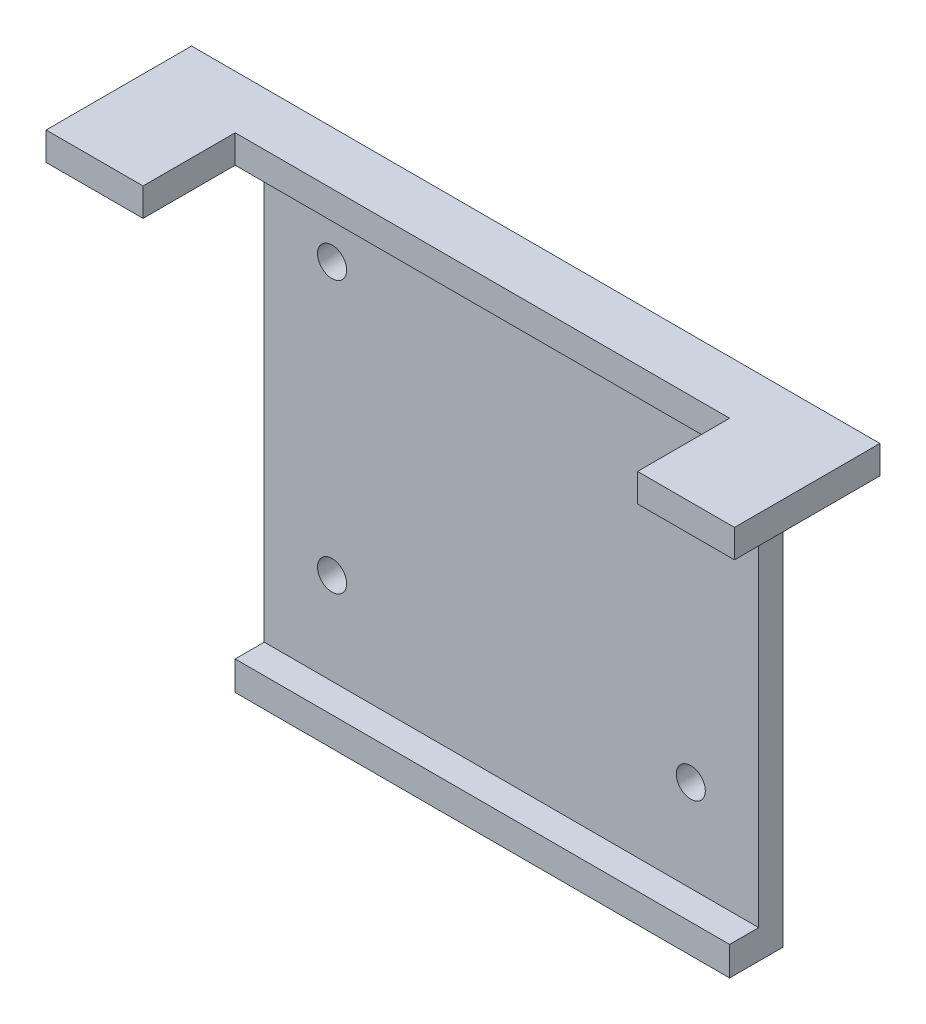
ISO-10303-21;
HEADER;
FILE_DESCRIPTION(('STEP AP214'),'2;1');
FILE_NAME('part.step','',(''),(''),'','','');
FILE_SCHEMA(('AUTOMOTIVE_DESIGN { 1 0 10303 214 1 1 1 1 }'));
ENDSEC;
DATA;
#1=APPLICATION_CONTEXT('core data for automotive mechanical design processes');
#2=APPLICATION_PROTOCOL_DEFINITION('international standard','automotive_design',2000,#1);
#3=PRODUCT_CONTEXT('',#1,'mechanical');
#4=PRODUCT('Part','Part','',(#3));
#5=PRODUCT_RELATED_PRODUCT_CATEGORY('part','',(#4));
#6=PRODUCT_DEFINITION_FORMATION('','',#4);
#7=PRODUCT_DEFINITION_CONTEXT('part definition',#1,'design');
#8=PRODUCT_DEFINITION('design','',#6,#7);
#9=PRODUCT_DEFINITION_SHAPE('','',#8);
#10=(LENGTH_UNIT() NAMED_UNIT(*) SI_UNIT(.MILLI.,.METRE.));
#11=(NAMED_UNIT(*) PLANE_ANGLE_UNIT() SI_UNIT($,.RADIAN.));
#12=(NAMED_UNIT(*) SI_UNIT($,.STERADIAN.) SOLID_ANGLE_UNIT());
#13=UNCERTAINTY_MEASURE_WITH_UNIT(LENGTH_MEASURE(1.E-05),#10,'distance_accuracy_value','');
#14=(GEOMETRIC_REPRESENTATION_CONTEXT(3) GLOBAL_UNCERTAINTY_ASSIGNED_CONTEXT((#13)) GLOBAL_UNIT_ASSIGNED_CONTEXT((#10,
#11,#12)) REPRESENTATION_CONTEXT('',''));
#15=CARTESIAN_POINT('',(0.,0.,0.));
#16=DIRECTION('',(0.,0.,1.));
#17=DIRECTION('',(1.,0.,0.));
#18=AXIS2_PLACEMENT_3D('',#15,#16,#17);
#19=CARTESIAN_POINT('',(25.5,25.,2.5));
#20=DIRECTION('',(-1.,0.,0.));
#21=DIRECTION('',(0.,-1.,0.));
#22=AXIS2_PLACEMENT_3D('',#19,#20,#21);
#23=PLANE('',#22);
#24=DIRECTION('',(0.,0.,-1.));
#25=VECTOR('',#24,1.);
#26=CARTESIAN_POINT('',(25.5,22.0999999999908,15.));
#27=LINE('',#26,#25);
#28=CARTESIAN_POINT('',(25.5,22.0999999999908,2.5));
#29=VERTEX_POINT('',#28);
#30=CARTESIAN_POINT('',(25.5,22.0999999999908,0.));
#31=VERTEX_POINT('',#30);
#32=EDGE_CURVE('E11',#29,#31,#27,.T.);
#33=ORIENTED_EDGE('',*,*,#32,.F.);
#34=DIRECTION('',(0.,1.,0.));
#35=VECTOR('',#34,1.);
#36=CARTESIAN_POINT('',(25.5,25.,2.5));
#37=LINE('',#36,#35);
#38=CARTESIAN_POINT('',(25.5,-22.,2.5));
#39=VERTEX_POINT('',#38);
#40=EDGE_CURVE('E233',#39,#29,#37,.T.);
#41=ORIENTED_EDGE('',*,*,#40,.F.);
#42=DIRECTION('',(0.,0.,-1.));
#43=VECTOR('',#42,1.);
#44=CARTESIAN_POINT('',(25.5,-22.,5.5));
#45=LINE('',#44,#43);
#46=CARTESIAN_POINT('',(25.5,-22.,5.5));
#47=VERTEX_POINT('',#46);
#48=EDGE_CURVE('E176',#47,#39,#45,.T.);
#49=ORIENTED_EDGE('',*,*,#48,.F.);
#50=DIRECTION('',(0.,1.,0.));
#51=VECTOR('',#50,1.);
#52=CARTESIAN_POINT('',(25.5,-25.,5.5));
#53=LINE('',#52,#51);
#54=CARTESIAN_POINT('',(25.5,-25.,5.5));
#55=VERTEX_POINT('',#54);
#56=EDGE_CURVE('E190',#55,#47,#53,.T.);
#57=ORIENTED_EDGE('',*,*,#56,.F.);
#58=DIRECTION('',(0.,0.,-1.));
#59=VECTOR('',#58,1.);
#60=CARTESIAN_POINT('',(25.5,-25.,2.5));
#61=LINE('',#60,#59);
#62=CARTESIAN_POINT('',(25.5,-25.,0.));
#63=VERTEX_POINT('',#62);
#64=EDGE_CURVE('E239',#55,#63,#61,.T.);
#65=ORIENTED_EDGE('',*,*,#64,.T.);
#66=DIRECTION('',(0.,1.,0.));
#67=VECTOR('',#66,1.);
#68=CARTESIAN_POINT('',(25.5,25.,0.));
#69=LINE('',#68,#67);
#70=EDGE_CURVE('E207',#63,#31,#69,.T.);
#71=ORIENTED_EDGE('',*,*,#70,.T.);
#72=EDGE_LOOP('',(#33,#41,#49,#57,#65,#71));
#73=FACE_BOUND('',#72,.T.);
#74=ADVANCED_FACE('F39',(#73),#23,.F.);
#75=CARTESIAN_POINT('',(-25.5,25.,2.5));
#76=DIRECTION('',(0.,-1.,0.));
#77=DIRECTION('',(0.,0.,-1.));
#78=AXIS2_PLACEMENT_3D('',#75,#76,#77);
#79=PLANE('',#78);
#80=DIRECTION('',(0.,0.,-1.));
#81=VECTOR('',#80,1.);
#82=CARTESIAN_POINT('',(-25.5,25.,15.));
#83=LINE('',#82,#81);
#84=CARTESIAN_POINT('',(-25.5,25.,15.));
#85=VERTEX_POINT('',#84);
#86=CARTESIAN_POINT('',(-25.5,25.,5.5));
#87=VERTEX_POINT('',#86);
#88=EDGE_CURVE('E167',#85,#87,#83,.T.);
#89=ORIENTED_EDGE('',*,*,#88,.T.);
#90=DIRECTION('',(-1.,0.,0.));
#91=VECTOR('',#90,1.);
#92=CARTESIAN_POINT('',(-25.5,25.,5.5));
#93=LINE('',#92,#91);
#94=CARTESIAN_POINT('',(25.5,25.,5.5));
#95=VERTEX_POINT('',#94);
#96=EDGE_CURVE('E159',#95,#87,#93,.T.);
#97=ORIENTED_EDGE('',*,*,#96,.F.);
#98=DIRECTION('',(0.,0.,-1.));
#99=VECTOR('',#98,1.);
#100=CARTESIAN_POINT('',(25.5,25.,15.));
#101=LINE('',#100,#99);
#102=CARTESIAN_POINT('',(25.5,25.,15.));
#103=VERTEX_POINT('',#102);
#104=EDGE_CURVE('E143',#103,#95,#101,.T.);
#105=ORIENTED_EDGE('',*,*,#104,.F.);
#106=DIRECTION('',(1.,0.,0.));
#107=VECTOR('',#106,1.);
#108=CARTESIAN_POINT('',(25.5,25.,15.));
#109=LINE('',#108,#107);
#110=CARTESIAN_POINT('',(35.5,25.,15.));
#111=VERTEX_POINT('',#110);
#112=EDGE_CURVE('E194',#103,#111,#109,.T.);
#113=ORIENTED_EDGE('',*,*,#112,.T.);
#114=DIRECTION('',(0.,0.,-1.));
#115=VECTOR('',#114,1.);
#116=CARTESIAN_POINT('',(35.5,25.,15.));
#117=LINE('',#116,#115);
#118=CARTESIAN_POINT('',(35.5,25.,0.));
#119=VERTEX_POINT('',#118);
#120=EDGE_CURVE('E155',#111,#119,#117,.T.);
#121=ORIENTED_EDGE('',*,*,#120,.T.);
#122=DIRECTION('',(-1.,0.,0.));
#123=VECTOR('',#122,1.);
#124=CARTESIAN_POINT('',(-25.5,25.,0.));
#125=LINE('',#124,#123);
#126=CARTESIAN_POINT('',(-35.5,25.,0.));
#127=VERTEX_POINT('',#126);
#128=EDGE_CURVE('E241',#119,#127,#125,.T.);
#129=ORIENTED_EDGE('',*,*,#128,.T.);
#130=DIRECTION('',(0.,0.,-1.));
#131=VECTOR('',#130,1.);
#132=CARTESIAN_POINT('',(-35.5,25.,15.));
#133=LINE('',#132,#131);
#134=CARTESIAN_POINT('',(-35.5,25.,15.));
#135=VERTEX_POINT('',#134);
#136=EDGE_CURVE('E169',#135,#127,#133,.T.);
#137=ORIENTED_EDGE('',*,*,#136,.F.);
#138=DIRECTION('',(1.,0.,0.));
#139=VECTOR('',#138,1.);
#140=CARTESIAN_POINT('',(-25.5,25.,15.));
#141=LINE('',#140,#139);
#142=EDGE_CURVE('E214',#135,#85,#141,.T.);
#143=ORIENTED_EDGE('',*,*,#142,.T.);
#144=EDGE_LOOP('',(#89,#97,#105,#113,#121,#129,#137,#143));
#145=FACE_BOUND('',#144,.T.);
#146=ADVANCED_FACE('F163',(#145),#79,.F.);
#147=CARTESIAN_POINT('',(-25.5,25.,2.5));
#148=DIRECTION('',(1.,0.,0.));
#149=DIRECTION('',(0.,1.,0.));
#150=AXIS2_PLACEMENT_3D('',#147,#148,#149);
#151=PLANE('',#150);
#152=DIRECTION('',(0.,-1.,0.));
#153=VECTOR('',#152,1.);
#154=CARTESIAN_POINT('',(-25.5,25.,2.5));
#155=LINE('',#154,#153);
#156=CARTESIAN_POINT('',(-25.5,22.0999999999908,2.5));
#157=VERTEX_POINT('',#156);
#158=CARTESIAN_POINT('',(-25.5,-22.,2.5));
#159=VERTEX_POINT('',#158);
#160=EDGE_CURVE('E237',#157,#159,#155,.T.);
#161=ORIENTED_EDGE('',*,*,#160,.F.);
#162=DIRECTION('',(0.,0.,-1.));
#163=VECTOR('',#162,1.);
#164=CARTESIAN_POINT('',(-25.5,22.0999999999908,15.));
#165=LINE('',#164,#163);
#166=CARTESIAN_POINT('',(-25.5,22.0999999999908,0.));
#167=VERTEX_POINT('',#166);
#168=EDGE_CURVE('E50',#157,#167,#165,.T.);
#169=ORIENTED_EDGE('',*,*,#168,.T.);
#170=DIRECTION('',(0.,-1.,0.));
#171=VECTOR('',#170,1.);
#172=CARTESIAN_POINT('',(-25.5,25.,0.));
#173=LINE('',#172,#171);
#174=CARTESIAN_POINT('',(-25.5,-25.,0.));
#175=VERTEX_POINT('',#174);
#176=EDGE_CURVE('E242',#167,#175,#173,.T.);
#177=ORIENTED_EDGE('',*,*,#176,.T.);
#178=DIRECTION('',(0.,0.,-1.));
#179=VECTOR('',#178,1.);
#180=CARTESIAN_POINT('',(-25.5,-25.,2.5));
#181=LINE('',#180,#179);
#182=CARTESIAN_POINT('',(-25.5,-25.,5.5));
#183=VERTEX_POINT('',#182);
#184=EDGE_CURVE('E45',#183,#175,#181,.T.);
#185=ORIENTED_EDGE('',*,*,#184,.F.);
#186=DIRECTION('',(0.,-1.,0.));
#187=VECTOR('',#186,1.);
#188=CARTESIAN_POINT('',(-25.5,-25.,5.5));
#189=LINE('',#188,#187);
#190=CARTESIAN_POINT('',(-25.5,-22.,5.5));
#191=VERTEX_POINT('',#190);
#192=EDGE_CURVE('E183',#191,#183,#189,.T.);
#193=ORIENTED_EDGE('',*,*,#192,.F.);
#194=DIRECTION('',(0.,0.,-1.));
#195=VECTOR('',#194,1.);
#196=CARTESIAN_POINT('',(-25.5,-22.,5.5));
#197=LINE('',#196,#195);
#198=EDGE_CURVE('E178',#191,#159,#197,.T.);
#199=ORIENTED_EDGE('',*,*,#198,.T.);
#200=EDGE_LOOP('',(#161,#169,#177,#185,#193,#199));
#201=FACE_BOUND('',#200,.T.);
#202=ADVANCED_FACE('F256',(#201),#151,.F.);
#203=CARTESIAN_POINT('',(-25.5,-25.,2.5));
#204=DIRECTION('',(0.,1.,0.));
#205=DIRECTION('',(0.,0.,1.));
#206=AXIS2_PLACEMENT_3D('',#203,#204,#205);
#207=PLANE('',#206);
#208=DIRECTION('',(1.,0.,0.));
#209=VECTOR('',#208,1.);
#210=CARTESIAN_POINT('',(-25.5,-25.,0.));
#211=LINE('',#210,#209);
#212=EDGE_CURVE('E240',#175,#63,#211,.T.);
#213=ORIENTED_EDGE('',*,*,#212,.T.);
#214=ORIENTED_EDGE('',*,*,#64,.F.);
#215=DIRECTION('',(1.,0.,0.));
#216=VECTOR('',#215,1.);
#217=CARTESIAN_POINT('',(-25.5,-25.,5.5));
#218=LINE('',#217,#216);
#219=EDGE_CURVE('E188',#183,#55,#218,.T.);
#220=ORIENTED_EDGE('',*,*,#219,.F.);
#221=ORIENTED_EDGE('',*,*,#184,.T.);
#222=EDGE_LOOP('',(#213,#214,#220,#221));
#223=FACE_BOUND('',#222,.T.);
#224=ADVANCED_FACE('F265',(#223),#207,.F.);
#225=CARTESIAN_POINT('',(0.,0.,2.5));
#226=DIRECTION('',(0.,0.,1.));
#227=DIRECTION('',(1.,0.,0.));
#228=AXIS2_PLACEMENT_3D('',#225,#226,#227);
#229=PLANE('',#228);
#230=CARTESIAN_POINT('',(-18.5060420360549,15.4681702742829,2.5));
#231=DIRECTION('',(0.,0.,1.));
#232=DIRECTION('',(1.,0.,0.));
#233=AXIS2_PLACEMENT_3D('',#230,#231,#232);
#234=CIRCLE('',#233,1.5);
#235=CARTESIAN_POINT('',(-17.0060420360549,15.4681702742829,2.5));
#236=VERTEX_POINT('',#235);
#237=EDGE_CURVE('E179',#236,#236,#234,.T.);
#238=ORIENTED_EDGE('',*,*,#237,.F.);
#239=EDGE_LOOP('',(#238));
#240=FACE_BOUND('',#239,.T.);
#241=CARTESIAN_POINT('',(18.5059556705768,15.4681702742829,2.5));
#242=DIRECTION('',(0.,0.,1.));
#243=DIRECTION('',(1.,0.,0.));
#244=AXIS2_PLACEMENT_3D('',#241,#242,#243);
#245=CIRCLE('',#244,1.5);
#246=CARTESIAN_POINT('',(20.0059556705768,15.4681702742829,2.5));
#247=VERTEX_POINT('',#246);
#248=EDGE_CURVE('E340',#247,#247,#245,.T.);
#249=ORIENTED_EDGE('',*,*,#248,.F.);
#250=EDGE_LOOP('',(#249));
#251=FACE_BOUND('',#250,.T.);
#252=CARTESIAN_POINT('',(18.4939567116963,-12.5318321147351,2.5));
#253=DIRECTION('',(0.,0.,1.));
#254=DIRECTION('',(1.,0.,0.));
#255=AXIS2_PLACEMENT_3D('',#252,#253,#254);
#256=CIRCLE('',#255,1.5);
#257=CARTESIAN_POINT('',(19.9939567116963,-12.5318321147351,2.5));
#258=VERTEX_POINT('',#257);
#259=EDGE_CURVE('E339',#258,#258,#256,.T.);
#260=ORIENTED_EDGE('',*,*,#259,.F.);
#261=EDGE_LOOP('',(#260));
#262=FACE_BOUND('',#261,.T.);
#263=CARTESIAN_POINT('',(-18.5060420360549,-12.5318372566994,2.5));
#264=DIRECTION('',(0.,0.,1.));
#265=DIRECTION('',(1.,0.,0.));
#266=AXIS2_PLACEMENT_3D('',#263,#264,#265);
#267=CIRCLE('',#266,1.5);
#268=CARTESIAN_POINT('',(-17.0060420360549,-12.5318372566994,2.5));
#269=VERTEX_POINT('',#268);
#270=EDGE_CURVE('E342',#269,#269,#267,.T.);
#271=ORIENTED_EDGE('',*,*,#270,.F.);
#272=EDGE_LOOP('',(#271));
#273=FACE_BOUND('',#272,.T.);
#274=DIRECTION('',(1.,0.,0.));
#275=VECTOR('',#274,1.);
#276=CARTESIAN_POINT('',(-25.5,22.0999999999908,2.5));
#277=LINE('',#276,#275);
#278=EDGE_CURVE('E175',#157,#29,#277,.T.);
#279=ORIENTED_EDGE('',*,*,#278,.F.);
#280=ORIENTED_EDGE('',*,*,#160,.T.);
#281=DIRECTION('',(-1.,0.,0.));
#282=VECTOR('',#281,1.);
#283=CARTESIAN_POINT('',(-25.5,-22.,2.5));
#284=LINE('',#283,#282);
#285=EDGE_CURVE('E57',#39,#159,#284,.T.);
#286=ORIENTED_EDGE('',*,*,#285,.F.);
#287=ORIENTED_EDGE('',*,*,#40,.T.);
#288=EDGE_LOOP('',(#279,#280,#286,#287));
#289=FACE_BOUND('',#288,.T.);
#290=ADVANCED_FACE('F294',(#240,#251,#262,#273,#289),#229,.T.);
#291=CARTESIAN_POINT('',(0.,0.,0.));
#292=DIRECTION('',(0.,0.,1.));
#293=DIRECTION('',(1.,0.,0.));
#294=AXIS2_PLACEMENT_3D('',#291,#292,#293);
#295=PLANE('',#294);
#296=CARTESIAN_POINT('',(-18.5060420360549,15.4681702742829,0.));
#297=DIRECTION('',(0.,0.,-1.));
#298=DIRECTION('',(-1.,0.,0.));
#299=AXIS2_PLACEMENT_3D('',#296,#297,#298);
#300=CIRCLE('',#299,1.5);
#301=CARTESIAN_POINT('',(-20.0060420360549,15.4681702742829,0.));
#302=VERTEX_POINT('',#301);
#303=EDGE_CURVE('E348',#302,#302,#300,.T.);
#304=ORIENTED_EDGE('',*,*,#303,.F.);
#305=EDGE_LOOP('',(#304));
#306=FACE_BOUND('',#305,.T.);
#307=CARTESIAN_POINT('',(18.5059556705768,15.4681702742829,0.));
#308=DIRECTION('',(0.,0.,-1.));
#309=DIRECTION('',(-1.,0.,0.));
#310=AXIS2_PLACEMENT_3D('',#307,#308,#309);
#311=CIRCLE('',#310,1.5);
#312=CARTESIAN_POINT('',(17.0059556705768,15.4681702742829,0.));
#313=VERTEX_POINT('',#312);
#314=EDGE_CURVE('E352',#313,#313,#311,.T.);
#315=ORIENTED_EDGE('',*,*,#314,.F.);
#316=EDGE_LOOP('',(#315));
#317=FACE_BOUND('',#316,.T.);
#318=CARTESIAN_POINT('',(18.4939567116963,-12.5318321147351,0.));
#319=DIRECTION('',(0.,0.,-1.));
#320=DIRECTION('',(-1.,0.,0.));
#321=AXIS2_PLACEMENT_3D('',#318,#319,#320);
#322=CIRCLE('',#321,1.5);
#323=CARTESIAN_POINT('',(16.9939567116963,-12.5318321147351,0.));
#324=VERTEX_POINT('',#323);
#325=EDGE_CURVE('E349',#324,#324,#322,.T.);
#326=ORIENTED_EDGE('',*,*,#325,.F.);
#327=EDGE_LOOP('',(#326));
#328=FACE_BOUND('',#327,.T.);
#329=CARTESIAN_POINT('',(-18.5060420360549,-12.5318372566994,0.));
#330=DIRECTION('',(0.,0.,-1.));
#331=DIRECTION('',(-1.,0.,0.));
#332=AXIS2_PLACEMENT_3D('',#329,#330,#331);
#333=CIRCLE('',#332,1.5);
#334=CARTESIAN_POINT('',(-20.0060420360549,-12.5318372566994,0.));
#335=VERTEX_POINT('',#334);
#336=EDGE_CURVE('E347',#335,#335,#333,.T.);
#337=ORIENTED_EDGE('',*,*,#336,.F.);
#338=EDGE_LOOP('',(#337));
#339=FACE_BOUND('',#338,.T.);
#340=ORIENTED_EDGE('',*,*,#70,.F.);
#341=ORIENTED_EDGE('',*,*,#212,.F.);
#342=ORIENTED_EDGE('',*,*,#176,.F.);
#343=DIRECTION('',(-1.,0.,0.));
#344=VECTOR('',#343,1.);
#345=CARTESIAN_POINT('',(-25.5,22.0999999999908,0.));
#346=LINE('',#345,#344);
#347=CARTESIAN_POINT('',(-35.5,22.0999999999908,0.));
#348=VERTEX_POINT('',#347);
#349=EDGE_CURVE('E206',#167,#348,#346,.T.);
#350=ORIENTED_EDGE('',*,*,#349,.T.);
#351=DIRECTION('',(0.,1.,0.));
#352=VECTOR('',#351,1.);
#353=CARTESIAN_POINT('',(-35.5,25.,0.));
#354=LINE('',#353,#352);
#355=EDGE_CURVE('E219',#348,#127,#354,.T.);
#356=ORIENTED_EDGE('',*,*,#355,.T.);
#357=ORIENTED_EDGE('',*,*,#128,.F.);
#358=DIRECTION('',(0.,-1.,0.));
#359=VECTOR('',#358,1.);
#360=CARTESIAN_POINT('',(35.5,25.,0.));
#361=LINE('',#360,#359);
#362=CARTESIAN_POINT('',(35.5,22.0999999999908,0.));
#363=VERTEX_POINT('',#362);
#364=EDGE_CURVE('E201',#119,#363,#361,.T.);
#365=ORIENTED_EDGE('',*,*,#364,.T.);
#366=DIRECTION('',(-1.,0.,0.));
#367=VECTOR('',#366,1.);
#368=CARTESIAN_POINT('',(25.5,22.0999999999908,0.));
#369=LINE('',#368,#367);
#370=EDGE_CURVE('E198',#363,#31,#369,.T.);
#371=ORIENTED_EDGE('',*,*,#370,.T.);
#372=EDGE_LOOP('',(#340,#341,#342,#350,#356,#357,#365,#371));
#373=FACE_BOUND('',#372,.T.);
#374=ADVANCED_FACE('F261',(#306,#317,#328,#339,#373),#295,.F.);
#375=CARTESIAN_POINT('',(-25.5,25.,15.));
#376=DIRECTION('',(1.,0.,0.));
#377=DIRECTION('',(0.,1.,0.));
#378=AXIS2_PLACEMENT_3D('',#375,#376,#377);
#379=PLANE('',#378);
#380=DIRECTION('',(0.,-1.,0.));
#381=VECTOR('',#380,1.);
#382=CARTESIAN_POINT('',(-25.5,25.,5.5));
#383=LINE('',#382,#381);
#384=CARTESIAN_POINT('',(-25.5,22.0999999999908,5.5));
#385=VERTEX_POINT('',#384);
#386=EDGE_CURVE('E174',#87,#385,#383,.T.);
#387=ORIENTED_EDGE('',*,*,#386,.F.);
#388=ORIENTED_EDGE('',*,*,#88,.F.);
#389=DIRECTION('',(0.,-1.,0.));
#390=VECTOR('',#389,1.);
#391=CARTESIAN_POINT('',(-25.5,25.,15.));
#392=LINE('',#391,#390);
#393=CARTESIAN_POINT('',(-25.5,22.0999999999908,15.));
#394=VERTEX_POINT('',#393);
#395=EDGE_CURVE('E224',#85,#394,#392,.T.);
#396=ORIENTED_EDGE('',*,*,#395,.T.);
#397=EDGE_CURVE('E63',#394,#385,#165,.T.);
#398=ORIENTED_EDGE('',*,*,#397,.T.);
#399=EDGE_LOOP('',(#387,#388,#396,#398));
#400=FACE_BOUND('',#399,.T.);
#401=ADVANCED_FACE('F300',(#400),#379,.T.);
#402=CARTESIAN_POINT('',(-35.5,25.,15.));
#403=DIRECTION('',(-1.,0.,0.));
#404=DIRECTION('',(0.,0.,1.));
#405=AXIS2_PLACEMENT_3D('',#402,#403,#404);
#406=PLANE('',#405);
#407=ORIENTED_EDGE('',*,*,#355,.F.);
#408=DIRECTION('',(0.,0.,-1.));
#409=VECTOR('',#408,1.);
#410=CARTESIAN_POINT('',(-35.5,22.0999999999908,15.));
#411=LINE('',#410,#409);
#412=CARTESIAN_POINT('',(-35.5,22.0999999999908,15.));
#413=VERTEX_POINT('',#412);
#414=EDGE_CURVE('E216',#413,#348,#411,.T.);
#415=ORIENTED_EDGE('',*,*,#414,.F.);
#416=DIRECTION('',(0.,1.,0.));
#417=VECTOR('',#416,1.);
#418=CARTESIAN_POINT('',(-35.5,25.,15.));
#419=LINE('',#418,#417);
#420=EDGE_CURVE('E230',#413,#135,#419,.T.);
#421=ORIENTED_EDGE('',*,*,#420,.T.);
#422=ORIENTED_EDGE('',*,*,#136,.T.);
#423=EDGE_LOOP('',(#407,#415,#421,#422));
#424=FACE_BOUND('',#423,.T.);
#425=ADVANCED_FACE('F304',(#424),#406,.T.);
#426=CARTESIAN_POINT('',(0.,0.,15.));
#427=DIRECTION('',(0.,0.,-1.));
#428=DIRECTION('',(-1.,0.,0.));
#429=AXIS2_PLACEMENT_3D('',#426,#427,#428);
#430=PLANE('',#429);
#431=ORIENTED_EDGE('',*,*,#395,.F.);
#432=ORIENTED_EDGE('',*,*,#142,.F.);
#433=ORIENTED_EDGE('',*,*,#420,.F.);
#434=DIRECTION('',(-1.,0.,0.));
#435=VECTOR('',#434,1.);
#436=CARTESIAN_POINT('',(-25.5,22.0999999999908,15.));
#437=LINE('',#436,#435);
#438=EDGE_CURVE('E229',#394,#413,#437,.T.);
#439=ORIENTED_EDGE('',*,*,#438,.F.);
#440=EDGE_LOOP('',(#431,#432,#433,#439));
#441=FACE_BOUND('',#440,.T.);
#442=ADVANCED_FACE('F305',(#441),#430,.F.);
#443=CARTESIAN_POINT('',(25.5,25.,15.));
#444=DIRECTION('',(-1.,0.,0.));
#445=DIRECTION('',(0.,-1.,0.));
#446=AXIS2_PLACEMENT_3D('',#443,#444,#445);
#447=PLANE('',#446);
#448=DIRECTION('',(0.,1.,0.));
#449=VECTOR('',#448,1.);
#450=CARTESIAN_POINT('',(25.5,25.,5.5));
#451=LINE('',#450,#449);
#452=CARTESIAN_POINT('',(25.5,22.0999999999908,5.5));
#453=VERTEX_POINT('',#452);
#454=EDGE_CURVE('E145',#453,#95,#451,.T.);
#455=ORIENTED_EDGE('',*,*,#454,.F.);
#456=CARTESIAN_POINT('',(25.5,22.0999999999908,15.));
#457=VERTEX_POINT('',#456);
#458=EDGE_CURVE('E47',#457,#453,#27,.T.);
#459=ORIENTED_EDGE('',*,*,#458,.F.);
#460=DIRECTION('',(0.,1.,0.));
#461=VECTOR('',#460,1.);
#462=CARTESIAN_POINT('',(25.5,25.,15.));
#463=LINE('',#462,#461);
#464=EDGE_CURVE('E150',#457,#103,#463,.T.);
#465=ORIENTED_EDGE('',*,*,#464,.T.);
#466=ORIENTED_EDGE('',*,*,#104,.T.);
#467=EDGE_LOOP('',(#455,#459,#465,#466));
#468=FACE_BOUND('',#467,.T.);
#469=ADVANCED_FACE('F141',(#468),#447,.T.);
#470=CARTESIAN_POINT('',(25.5,22.0999999999908,15.));
#471=DIRECTION('',(0.,-1.,0.));
#472=DIRECTION('',(0.,0.,-1.));
#473=AXIS2_PLACEMENT_3D('',#470,#471,#472);
#474=PLANE('',#473);
#475=ORIENTED_EDGE('',*,*,#370,.F.);
#476=DIRECTION('',(0.,0.,-1.));
#477=VECTOR('',#476,1.);
#478=CARTESIAN_POINT('',(35.5,22.0999999999908,15.));
#479=LINE('',#478,#477);
#480=CARTESIAN_POINT('',(35.5,22.0999999999908,15.));
#481=VERTEX_POINT('',#480);
#482=EDGE_CURVE('E209',#481,#363,#479,.T.);
#483=ORIENTED_EDGE('',*,*,#482,.F.);
#484=DIRECTION('',(-1.,0.,0.));
#485=VECTOR('',#484,1.);
#486=CARTESIAN_POINT('',(25.5,22.0999999999908,15.));
#487=LINE('',#486,#485);
#488=EDGE_CURVE('E153',#481,#457,#487,.T.);
#489=ORIENTED_EDGE('',*,*,#488,.T.);
#490=ORIENTED_EDGE('',*,*,#458,.T.);
#491=DIRECTION('',(1.,0.,0.));
#492=VECTOR('',#491,1.);
#493=CARTESIAN_POINT('',(-25.5,22.0999999999908,5.5));
#494=LINE('',#493,#492);
#495=EDGE_CURVE('E161',#385,#453,#494,.T.);
#496=ORIENTED_EDGE('',*,*,#495,.F.);
#497=ORIENTED_EDGE('',*,*,#397,.F.);
#498=ORIENTED_EDGE('',*,*,#438,.T.);
#499=ORIENTED_EDGE('',*,*,#414,.T.);
#500=ORIENTED_EDGE('',*,*,#349,.F.);
#501=ORIENTED_EDGE('',*,*,#168,.F.);
#502=ORIENTED_EDGE('',*,*,#278,.T.);
#503=ORIENTED_EDGE('',*,*,#32,.T.);
#504=EDGE_LOOP('',(#475,#483,#489,#490,#496,#497,#498,#499,#500,#501,#502,#503));
#505=FACE_BOUND('',#504,.T.);
#506=ADVANCED_FACE('F314',(#505),#474,.T.);
#507=CARTESIAN_POINT('',(35.5,25.,15.));
#508=DIRECTION('',(1.,0.,0.));
#509=DIRECTION('',(0.,0.,-1.));
#510=AXIS2_PLACEMENT_3D('',#507,#508,#509);
#511=PLANE('',#510);
#512=ORIENTED_EDGE('',*,*,#364,.F.);
#513=ORIENTED_EDGE('',*,*,#120,.F.);
#514=DIRECTION('',(0.,-1.,0.));
#515=VECTOR('',#514,1.);
#516=CARTESIAN_POINT('',(35.5,25.,15.));
#517=LINE('',#516,#515);
#518=EDGE_CURVE('E196',#111,#481,#517,.T.);
#519=ORIENTED_EDGE('',*,*,#518,.T.);
#520=ORIENTED_EDGE('',*,*,#482,.T.);
#521=EDGE_LOOP('',(#512,#513,#519,#520));
#522=FACE_BOUND('',#521,.T.);
#523=ADVANCED_FACE('F312',(#522),#511,.T.);
#524=CARTESIAN_POINT('',(0.,0.,15.));
#525=DIRECTION('',(0.,0.,1.));
#526=DIRECTION('',(1.,0.,0.));
#527=AXIS2_PLACEMENT_3D('',#524,#525,#526);
#528=PLANE('',#527);
#529=ORIENTED_EDGE('',*,*,#464,.F.);
#530=ORIENTED_EDGE('',*,*,#488,.F.);
#531=ORIENTED_EDGE('',*,*,#518,.F.);
#532=ORIENTED_EDGE('',*,*,#112,.F.);
#533=EDGE_LOOP('',(#529,#530,#531,#532));
#534=FACE_BOUND('',#533,.T.);
#535=ADVANCED_FACE('F278',(#534),#528,.T.);
#536=CARTESIAN_POINT('',(0.,0.,5.5));
#537=DIRECTION('',(0.,0.,1.));
#538=DIRECTION('',(1.,0.,0.));
#539=AXIS2_PLACEMENT_3D('',#536,#537,#538);
#540=PLANE('',#539);
#541=ORIENTED_EDGE('',*,*,#386,.T.);
#542=ORIENTED_EDGE('',*,*,#495,.T.);
#543=ORIENTED_EDGE('',*,*,#454,.T.);
#544=ORIENTED_EDGE('',*,*,#96,.T.);
#545=EDGE_LOOP('',(#541,#542,#543,#544));
#546=FACE_BOUND('',#545,.T.);
#547=ADVANCED_FACE('F157',(#546),#540,.T.);
#548=CARTESIAN_POINT('',(-25.5,-22.,5.5));
#549=DIRECTION('',(0.,-1.,0.));
#550=DIRECTION('',(0.,0.,-1.));
#551=AXIS2_PLACEMENT_3D('',#548,#549,#550);
#552=PLANE('',#551);
#553=ORIENTED_EDGE('',*,*,#285,.T.);
#554=ORIENTED_EDGE('',*,*,#198,.F.);
#555=DIRECTION('',(-1.,0.,0.));
#556=VECTOR('',#555,1.);
#557=CARTESIAN_POINT('',(-25.5,-22.,5.5));
#558=LINE('',#557,#556);
#559=EDGE_CURVE('E181',#47,#191,#558,.T.);
#560=ORIENTED_EDGE('',*,*,#559,.F.);
#561=ORIENTED_EDGE('',*,*,#48,.T.);
#562=EDGE_LOOP('',(#553,#554,#560,#561));
#563=FACE_BOUND('',#562,.T.);
#564=ADVANCED_FACE('F271',(#563),#552,.F.);
#565=CARTESIAN_POINT('',(0.,0.,5.5));
#566=DIRECTION('',(0.,0.,-1.));
#567=DIRECTION('',(-1.,0.,0.));
#568=AXIS2_PLACEMENT_3D('',#565,#566,#567);
#569=PLANE('',#568);
#570=ORIENTED_EDGE('',*,*,#192,.T.);
#571=ORIENTED_EDGE('',*,*,#219,.T.);
#572=ORIENTED_EDGE('',*,*,#56,.T.);
#573=ORIENTED_EDGE('',*,*,#559,.T.);
#574=EDGE_LOOP('',(#570,#571,#572,#573));
#575=FACE_BOUND('',#574,.T.);
#576=ADVANCED_FACE('F262',(#575),#569,.F.);
#577=CARTESIAN_POINT('',(-18.5060420360549,-12.5318372566994,15.));
#578=DIRECTION('',(0.,0.,-1.));
#579=DIRECTION('',(-1.,0.,0.));
#580=AXIS2_PLACEMENT_3D('',#577,#578,#579);
#581=CYLINDRICAL_SURFACE('',#580,1.5);
#582=ORIENTED_EDGE('',*,*,#270,.T.);
#583=EDGE_LOOP('',(#582));
#584=FACE_BOUND('',#583,.T.);
#585=ORIENTED_EDGE('',*,*,#336,.T.);
#586=EDGE_LOOP('',(#585));
#587=FACE_BOUND('',#586,.T.);
#588=ADVANCED_FACE('F279',(#584,#587),#581,.F.);
#589=CARTESIAN_POINT('',(18.4939567116963,-12.5318321147351,15.));
#590=DIRECTION('',(0.,0.,-1.));
#591=DIRECTION('',(-1.,0.,0.));
#592=AXIS2_PLACEMENT_3D('',#589,#590,#591);
#593=CYLINDRICAL_SURFACE('',#592,1.5);
#594=ORIENTED_EDGE('',*,*,#259,.T.);
#595=EDGE_LOOP('',(#594));
#596=FACE_BOUND('',#595,.T.);
#597=ORIENTED_EDGE('',*,*,#325,.T.);
#598=EDGE_LOOP('',(#597));
#599=FACE_BOUND('',#598,.T.);
#600=ADVANCED_FACE('F358',(#596,#599),#593,.F.);
#601=CARTESIAN_POINT('',(18.5059556705768,15.4681702742829,15.));
#602=DIRECTION('',(0.,0.,-1.));
#603=DIRECTION('',(-1.,0.,0.));
#604=AXIS2_PLACEMENT_3D('',#601,#602,#603);
#605=CYLINDRICAL_SURFACE('',#604,1.5);
#606=ORIENTED_EDGE('',*,*,#248,.T.);
#607=EDGE_LOOP('',(#606));
#608=FACE_BOUND('',#607,.T.);
#609=ORIENTED_EDGE('',*,*,#314,.T.);
#610=EDGE_LOOP('',(#609));
#611=FACE_BOUND('',#610,.T.);
#612=ADVANCED_FACE('F367',(#608,#611),#605,.F.);
#613=CARTESIAN_POINT('',(-18.5060420360549,15.4681702742829,15.));
#614=DIRECTION('',(0.,0.,-1.));
#615=DIRECTION('',(-1.,0.,0.));
#616=AXIS2_PLACEMENT_3D('',#613,#614,#615);
#617=CYLINDRICAL_SURFACE('',#616,1.5);
#618=ORIENTED_EDGE('',*,*,#237,.T.);
#619=EDGE_LOOP('',(#618));
#620=FACE_BOUND('',#619,.T.);
#621=ORIENTED_EDGE('',*,*,#303,.T.);
#622=EDGE_LOOP('',(#621));
#623=FACE_BOUND('',#622,.T.);
#624=ADVANCED_FACE('F372',(#620,#623),#617,.F.);
#625=CLOSED_SHELL('',(#74,#146,#202,#224,#290,#374,#401,#425,#442,#469,#506,#523,#535,#547,#564,
#576,#588,#600,#612,#624));
#626=MANIFOLD_SOLID_BREP('B2',#625);
#627=ADVANCED_BREP_SHAPE_REPRESENTATION('',(#18,#626),#14);
#628=SHAPE_DEFINITION_REPRESENTATION(#9,#627);
ENDSEC;
END-ISO-10303-21;
